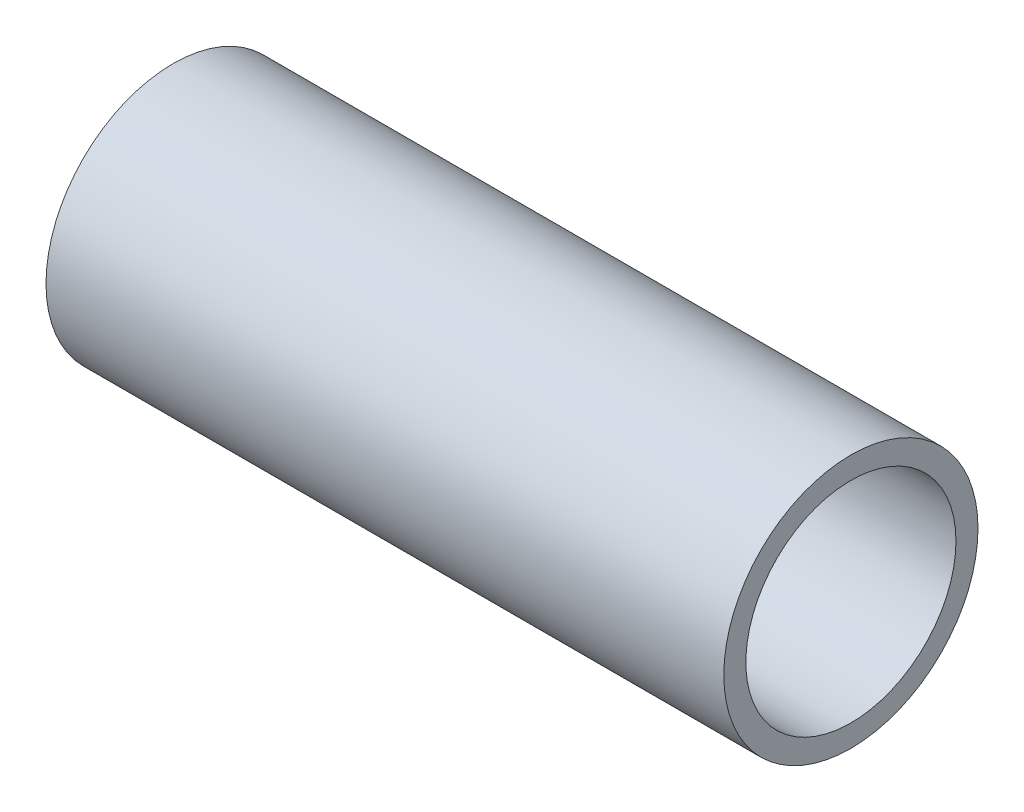
ISO-10303-21;
HEADER;
FILE_DESCRIPTION(('STEP AP214'),'2;1');
FILE_NAME('part.step','',(''),(''),'','','');
FILE_SCHEMA(('AUTOMOTIVE_DESIGN { 1 0 10303 214 1 1 1 1 }'));
ENDSEC;
DATA;
#1=APPLICATION_CONTEXT('core data for automotive mechanical design processes');
#2=APPLICATION_PROTOCOL_DEFINITION('international standard','automotive_design',2000,#1);
#3=PRODUCT_CONTEXT('',#1,'mechanical');
#4=PRODUCT('Part','Part','',(#3));
#5=PRODUCT_RELATED_PRODUCT_CATEGORY('part','',(#4));
#6=PRODUCT_DEFINITION_FORMATION('','',#4);
#7=PRODUCT_DEFINITION_CONTEXT('part definition',#1,'design');
#8=PRODUCT_DEFINITION('design','',#6,#7);
#9=PRODUCT_DEFINITION_SHAPE('','',#8);
#10=(LENGTH_UNIT() NAMED_UNIT(*) SI_UNIT(.MILLI.,.METRE.));
#11=(NAMED_UNIT(*) PLANE_ANGLE_UNIT() SI_UNIT($,.RADIAN.));
#12=(NAMED_UNIT(*) SI_UNIT($,.STERADIAN.) SOLID_ANGLE_UNIT());
#13=UNCERTAINTY_MEASURE_WITH_UNIT(LENGTH_MEASURE(1.E-05),#10,'distance_accuracy_value','');
#14=(GEOMETRIC_REPRESENTATION_CONTEXT(3) GLOBAL_UNCERTAINTY_ASSIGNED_CONTEXT((#13)) GLOBAL_UNIT_ASSIGNED_CONTEXT((#10,
#11,#12)) REPRESENTATION_CONTEXT('',''));
#15=CARTESIAN_POINT('',(0.,0.,0.));
#16=DIRECTION('',(0.,0.,1.));
#17=DIRECTION('',(1.,0.,0.));
#18=AXIS2_PLACEMENT_3D('',#15,#16,#17);
#19=CARTESIAN_POINT('',(25.4,0.,0.));
#20=DIRECTION('',(1.,0.,0.));
#21=DIRECTION('',(0.,0.,-1.));
#22=AXIS2_PLACEMENT_3D('',#19,#20,#21);
#23=PLANE('',#22);
#24=CARTESIAN_POINT('',(25.4,0.,0.));
#25=DIRECTION('',(1.,0.,0.));
#26=DIRECTION('',(0.,0.,-1.));
#27=AXIS2_PLACEMENT_3D('',#24,#25,#26);
#28=CIRCLE('',#27,9.525);
#29=CARTESIAN_POINT('',(25.4,0.,-9.525));
#30=VERTEX_POINT('',#29);
#31=EDGE_CURVE('E10',#30,#30,#28,.T.);
#32=ORIENTED_EDGE('',*,*,#31,.T.);
#33=EDGE_LOOP('',(#32));
#34=FACE_BOUND('',#33,.T.);
#35=CARTESIAN_POINT('',(25.4,0.,0.));
#36=DIRECTION('',(1.,0.,0.));
#37=DIRECTION('',(0.,0.,-1.));
#38=AXIS2_PLACEMENT_3D('',#35,#36,#37);
#39=CIRCLE('',#38,7.874);
#40=CARTESIAN_POINT('',(25.4,0.,-7.874));
#41=VERTEX_POINT('',#40);
#42=EDGE_CURVE('E44',#41,#41,#39,.T.);
#43=ORIENTED_EDGE('',*,*,#42,.F.);
#44=EDGE_LOOP('',(#43));
#45=FACE_BOUND('',#44,.T.);
#46=ADVANCED_FACE('F33',(#34,#45),#23,.T.);
#47=CARTESIAN_POINT('',(-25.4,0.,0.));
#48=DIRECTION('',(1.,0.,0.));
#49=DIRECTION('',(0.,0.,-1.));
#50=AXIS2_PLACEMENT_3D('',#47,#48,#49);
#51=PLANE('',#50);
#52=CARTESIAN_POINT('',(-25.4,0.,0.));
#53=DIRECTION('',(1.,0.,0.));
#54=DIRECTION('',(0.,0.,-1.));
#55=AXIS2_PLACEMENT_3D('',#52,#53,#54);
#56=CIRCLE('',#55,9.525);
#57=CARTESIAN_POINT('',(-25.4,0.,-9.525));
#58=VERTEX_POINT('',#57);
#59=EDGE_CURVE('E37',#58,#58,#56,.T.);
#60=ORIENTED_EDGE('',*,*,#59,.F.);
#61=EDGE_LOOP('',(#60));
#62=FACE_BOUND('',#61,.T.);
#63=CARTESIAN_POINT('',(-25.4,0.,0.));
#64=DIRECTION('',(1.,0.,0.));
#65=DIRECTION('',(0.,0.,-1.));
#66=AXIS2_PLACEMENT_3D('',#63,#64,#65);
#67=CIRCLE('',#66,7.874);
#68=CARTESIAN_POINT('',(-25.4,0.,-7.874));
#69=VERTEX_POINT('',#68);
#70=EDGE_CURVE('E46',#69,#69,#67,.T.);
#71=ORIENTED_EDGE('',*,*,#70,.T.);
#72=EDGE_LOOP('',(#71));
#73=FACE_BOUND('',#72,.T.);
#74=ADVANCED_FACE('F56',(#62,#73),#51,.F.);
#75=CARTESIAN_POINT('',(25.4,0.,0.));
#76=DIRECTION('',(-1.,0.,0.));
#77=DIRECTION('',(0.,0.,1.));
#78=AXIS2_PLACEMENT_3D('',#75,#76,#77);
#79=CYLINDRICAL_SURFACE('',#78,9.525);
#80=ORIENTED_EDGE('',*,*,#31,.F.);
#81=EDGE_LOOP('',(#80));
#82=FACE_BOUND('',#81,.T.);
#83=ORIENTED_EDGE('',*,*,#59,.T.);
#84=EDGE_LOOP('',(#83));
#85=FACE_BOUND('',#84,.T.);
#86=ADVANCED_FACE('F35',(#82,#85),#79,.T.);
#87=CARTESIAN_POINT('',(25.4,0.,0.));
#88=DIRECTION('',(-1.,0.,0.));
#89=DIRECTION('',(0.,0.,1.));
#90=AXIS2_PLACEMENT_3D('',#87,#88,#89);
#91=CYLINDRICAL_SURFACE('',#90,7.874);
#92=ORIENTED_EDGE('',*,*,#42,.T.);
#93=EDGE_LOOP('',(#92));
#94=FACE_BOUND('',#93,.T.);
#95=ORIENTED_EDGE('',*,*,#70,.F.);
#96=EDGE_LOOP('',(#95));
#97=FACE_BOUND('',#96,.T.);
#98=ADVANCED_FACE('F52',(#94,#97),#91,.F.);
#99=CLOSED_SHELL('',(#46,#74,#86,#98));
#100=MANIFOLD_SOLID_BREP('B2',#99);
#101=ADVANCED_BREP_SHAPE_REPRESENTATION('',(#18,#100),#14);
#102=SHAPE_DEFINITION_REPRESENTATION(#9,#101);
ENDSEC;
END-ISO-10303-21;
